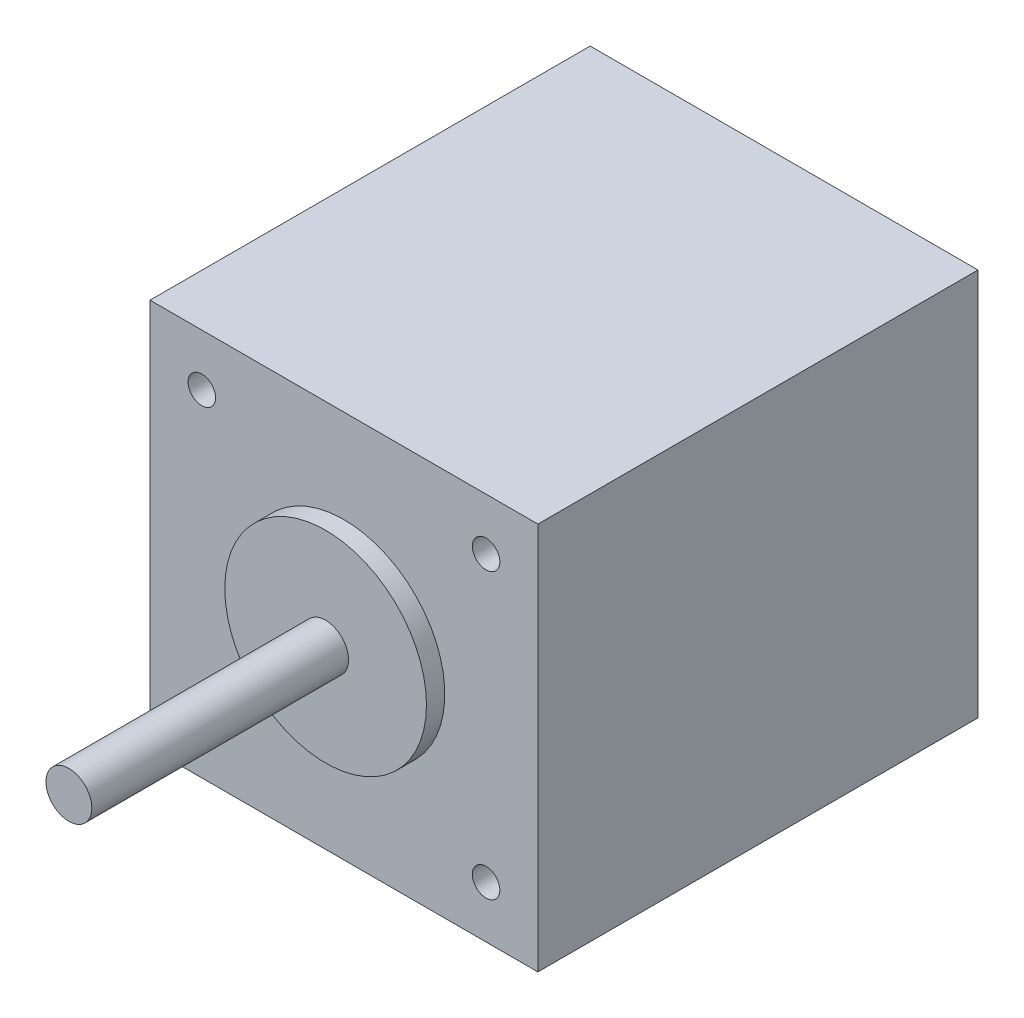
ISO-10303-21;
HEADER;
FILE_DESCRIPTION(('STEP AP214'),'2;1');
FILE_NAME('part.step','',(''),(''),'','','');
FILE_SCHEMA(('AUTOMOTIVE_DESIGN { 1 0 10303 214 1 1 1 1 }'));
ENDSEC;
DATA;
#1=APPLICATION_CONTEXT('core data for automotive mechanical design processes');
#2=APPLICATION_PROTOCOL_DEFINITION('international standard','automotive_design',2000,#1);
#3=PRODUCT_CONTEXT('',#1,'mechanical');
#4=PRODUCT('Part','Part','',(#3));
#5=PRODUCT_RELATED_PRODUCT_CATEGORY('part','',(#4));
#6=PRODUCT_DEFINITION_FORMATION('','',#4);
#7=PRODUCT_DEFINITION_CONTEXT('part definition',#1,'design');
#8=PRODUCT_DEFINITION('design','',#6,#7);
#9=PRODUCT_DEFINITION_SHAPE('','',#8);
#10=(LENGTH_UNIT() NAMED_UNIT(*) SI_UNIT(.MILLI.,.METRE.));
#11=(NAMED_UNIT(*) PLANE_ANGLE_UNIT() SI_UNIT($,.RADIAN.));
#12=(NAMED_UNIT(*) SI_UNIT($,.STERADIAN.) SOLID_ANGLE_UNIT());
#13=UNCERTAINTY_MEASURE_WITH_UNIT(LENGTH_MEASURE(1.E-05),#10,'distance_accuracy_value','');
#14=(GEOMETRIC_REPRESENTATION_CONTEXT(3) GLOBAL_UNCERTAINTY_ASSIGNED_CONTEXT((#13)) GLOBAL_UNIT_ASSIGNED_CONTEXT((#10,
#11,#12)) REPRESENTATION_CONTEXT('',''));
#15=CARTESIAN_POINT('',(0.,0.,0.));
#16=DIRECTION('',(0.,0.,1.));
#17=DIRECTION('',(1.,0.,0.));
#18=AXIS2_PLACEMENT_3D('',#15,#16,#17);
#19=CARTESIAN_POINT('',(21.15,-21.15,48.));
#20=DIRECTION('',(-1.,0.,0.));
#21=DIRECTION('',(0.,0.,1.));
#22=AXIS2_PLACEMENT_3D('',#19,#20,#21);
#23=PLANE('',#22);
#24=DIRECTION('',(0.,1.,0.));
#25=VECTOR('',#24,1.);
#26=CARTESIAN_POINT('',(21.15,-21.15,0.));
#27=LINE('',#26,#25);
#28=CARTESIAN_POINT('',(21.15,-21.15,0.));
#29=VERTEX_POINT('',#28);
#30=CARTESIAN_POINT('',(21.15,21.15,0.));
#31=VERTEX_POINT('',#30);
#32=EDGE_CURVE('E109',#29,#31,#27,.T.);
#33=ORIENTED_EDGE('',*,*,#32,.T.);
#34=DIRECTION('',(0.,0.,-1.));
#35=VECTOR('',#34,1.);
#36=CARTESIAN_POINT('',(21.15,21.15,48.));
#37=LINE('',#36,#35);
#38=CARTESIAN_POINT('',(21.15,21.15,48.));
#39=VERTEX_POINT('',#38);
#40=EDGE_CURVE('E50',#39,#31,#37,.T.);
#41=ORIENTED_EDGE('',*,*,#40,.F.);
#42=DIRECTION('',(0.,1.,0.));
#43=VECTOR('',#42,1.);
#44=CARTESIAN_POINT('',(21.15,-21.15,48.));
#45=LINE('',#44,#43);
#46=CARTESIAN_POINT('',(21.15,-21.15,48.));
#47=VERTEX_POINT('',#46);
#48=EDGE_CURVE('E95',#47,#39,#45,.T.);
#49=ORIENTED_EDGE('',*,*,#48,.F.);
#50=DIRECTION('',(0.,0.,-1.));
#51=VECTOR('',#50,1.);
#52=CARTESIAN_POINT('',(21.15,-21.15,48.));
#53=LINE('',#52,#51);
#54=EDGE_CURVE('E105',#47,#29,#53,.T.);
#55=ORIENTED_EDGE('',*,*,#54,.T.);
#56=EDGE_LOOP('',(#33,#41,#49,#55));
#57=FACE_BOUND('',#56,.T.);
#58=ADVANCED_FACE('F41',(#57),#23,.F.);
#59=CARTESIAN_POINT('',(-21.15,21.15,48.));
#60=DIRECTION('',(0.,-1.,0.));
#61=DIRECTION('',(0.,0.,-1.));
#62=AXIS2_PLACEMENT_3D('',#59,#60,#61);
#63=PLANE('',#62);
#64=DIRECTION('',(-1.,0.,0.));
#65=VECTOR('',#64,1.);
#66=CARTESIAN_POINT('',(-21.15,21.15,0.));
#67=LINE('',#66,#65);
#68=CARTESIAN_POINT('',(-21.15,21.15,0.));
#69=VERTEX_POINT('',#68);
#70=EDGE_CURVE('E100',#31,#69,#67,.T.);
#71=ORIENTED_EDGE('',*,*,#70,.T.);
#72=DIRECTION('',(0.,0.,-1.));
#73=VECTOR('',#72,1.);
#74=CARTESIAN_POINT('',(-21.15,21.15,48.));
#75=LINE('',#74,#73);
#76=CARTESIAN_POINT('',(-21.15,21.15,48.));
#77=VERTEX_POINT('',#76);
#78=EDGE_CURVE('E98',#77,#69,#75,.T.);
#79=ORIENTED_EDGE('',*,*,#78,.F.);
#80=DIRECTION('',(-1.,0.,0.));
#81=VECTOR('',#80,1.);
#82=CARTESIAN_POINT('',(-21.15,21.15,48.));
#83=LINE('',#82,#81);
#84=EDGE_CURVE('E90',#39,#77,#83,.T.);
#85=ORIENTED_EDGE('',*,*,#84,.F.);
#86=ORIENTED_EDGE('',*,*,#40,.T.);
#87=EDGE_LOOP('',(#71,#79,#85,#86));
#88=FACE_BOUND('',#87,.T.);
#89=ADVANCED_FACE('F99',(#88),#63,.F.);
#90=CARTESIAN_POINT('',(-21.15,-21.15,48.));
#91=DIRECTION('',(1.,0.,0.));
#92=DIRECTION('',(0.,0.,-1.));
#93=AXIS2_PLACEMENT_3D('',#90,#91,#92);
#94=PLANE('',#93);
#95=DIRECTION('',(0.,-1.,0.));
#96=VECTOR('',#95,1.);
#97=CARTESIAN_POINT('',(-21.15,-21.15,0.));
#98=LINE('',#97,#96);
#99=CARTESIAN_POINT('',(-21.15,-21.15,0.));
#100=VERTEX_POINT('',#99);
#101=EDGE_CURVE('E76',#69,#100,#98,.T.);
#102=ORIENTED_EDGE('',*,*,#101,.T.);
#103=DIRECTION('',(0.,0.,-1.));
#104=VECTOR('',#103,1.);
#105=CARTESIAN_POINT('',(-21.15,-21.15,48.));
#106=LINE('',#105,#104);
#107=CARTESIAN_POINT('',(-21.15,-21.15,48.));
#108=VERTEX_POINT('',#107);
#109=EDGE_CURVE('E101',#108,#100,#106,.T.);
#110=ORIENTED_EDGE('',*,*,#109,.F.);
#111=DIRECTION('',(0.,-1.,0.));
#112=VECTOR('',#111,1.);
#113=CARTESIAN_POINT('',(-21.15,-21.15,48.));
#114=LINE('',#113,#112);
#115=EDGE_CURVE('E93',#77,#108,#114,.T.);
#116=ORIENTED_EDGE('',*,*,#115,.F.);
#117=ORIENTED_EDGE('',*,*,#78,.T.);
#118=EDGE_LOOP('',(#102,#110,#116,#117));
#119=FACE_BOUND('',#118,.T.);
#120=ADVANCED_FACE('F103',(#119),#94,.F.);
#121=CARTESIAN_POINT('',(-21.15,-21.15,48.));
#122=DIRECTION('',(0.,1.,0.));
#123=DIRECTION('',(0.,0.,1.));
#124=AXIS2_PLACEMENT_3D('',#121,#122,#123);
#125=PLANE('',#124);
#126=DIRECTION('',(1.,0.,0.));
#127=VECTOR('',#126,1.);
#128=CARTESIAN_POINT('',(-21.15,-21.15,0.));
#129=LINE('',#128,#127);
#130=EDGE_CURVE('E82',#100,#29,#129,.T.);
#131=ORIENTED_EDGE('',*,*,#130,.T.);
#132=ORIENTED_EDGE('',*,*,#54,.F.);
#133=DIRECTION('',(1.,0.,0.));
#134=VECTOR('',#133,1.);
#135=CARTESIAN_POINT('',(-21.15,-21.15,48.));
#136=LINE('',#135,#134);
#137=EDGE_CURVE('E59',#108,#47,#136,.T.);
#138=ORIENTED_EDGE('',*,*,#137,.F.);
#139=ORIENTED_EDGE('',*,*,#109,.T.);
#140=EDGE_LOOP('',(#131,#132,#138,#139));
#141=FACE_BOUND('',#140,.T.);
#142=ADVANCED_FACE('F132',(#141),#125,.F.);
#143=CARTESIAN_POINT('',(0.,0.,48.));
#144=DIRECTION('',(0.,0.,-1.));
#145=DIRECTION('',(-1.,0.,0.));
#146=AXIS2_PLACEMENT_3D('',#143,#144,#145);
#147=PLANE('',#146);
#148=CARTESIAN_POINT('',(-15.5,15.5,48.));
#149=DIRECTION('',(0.,0.,1.));
#150=DIRECTION('',(1.,0.,0.));
#151=AXIS2_PLACEMENT_3D('',#148,#149,#150);
#152=CIRCLE('',#151,1.5);
#153=CARTESIAN_POINT('',(-14.,15.5,48.));
#154=VERTEX_POINT('',#153);
#155=EDGE_CURVE('E281',#154,#154,#152,.T.);
#156=ORIENTED_EDGE('',*,*,#155,.F.);
#157=EDGE_LOOP('',(#156));
#158=FACE_BOUND('',#157,.T.);
#159=CARTESIAN_POINT('',(15.5,-15.5,48.));
#160=DIRECTION('',(0.,0.,1.));
#161=DIRECTION('',(1.,0.,0.));
#162=AXIS2_PLACEMENT_3D('',#159,#160,#161);
#163=CIRCLE('',#162,1.5);
#164=CARTESIAN_POINT('',(17.,-15.5,48.));
#165=VERTEX_POINT('',#164);
#166=EDGE_CURVE('E287',#165,#165,#163,.T.);
#167=ORIENTED_EDGE('',*,*,#166,.F.);
#168=EDGE_LOOP('',(#167));
#169=FACE_BOUND('',#168,.T.);
#170=CARTESIAN_POINT('',(15.5,15.5,48.));
#171=DIRECTION('',(0.,0.,1.));
#172=DIRECTION('',(1.,0.,0.));
#173=AXIS2_PLACEMENT_3D('',#170,#171,#172);
#174=CIRCLE('',#173,1.5);
#175=CARTESIAN_POINT('',(17.,15.5,48.));
#176=VERTEX_POINT('',#175);
#177=EDGE_CURVE('E288',#176,#176,#174,.T.);
#178=ORIENTED_EDGE('',*,*,#177,.F.);
#179=EDGE_LOOP('',(#178));
#180=FACE_BOUND('',#179,.T.);
#181=CARTESIAN_POINT('',(-15.5,-15.5,48.));
#182=DIRECTION('',(0.,0.,1.));
#183=DIRECTION('',(1.,0.,0.));
#184=AXIS2_PLACEMENT_3D('',#181,#182,#183);
#185=CIRCLE('',#184,1.5);
#186=CARTESIAN_POINT('',(-14.,-15.5,48.));
#187=VERTEX_POINT('',#186);
#188=EDGE_CURVE('E278',#187,#187,#185,.T.);
#189=ORIENTED_EDGE('',*,*,#188,.F.);
#190=EDGE_LOOP('',(#189));
#191=FACE_BOUND('',#190,.T.);
#192=CARTESIAN_POINT('',(0.,0.,48.));
#193=DIRECTION('',(0.,0.,-1.));
#194=DIRECTION('',(-1.,0.,0.));
#195=AXIS2_PLACEMENT_3D('',#192,#193,#194);
#196=CIRCLE('',#195,11.);
#197=CARTESIAN_POINT('',(-11.,0.,48.));
#198=VERTEX_POINT('',#197);
#199=EDGE_CURVE('E11',#198,#198,#196,.F.);
#200=ORIENTED_EDGE('',*,*,#199,.F.);
#201=EDGE_LOOP('',(#200));
#202=FACE_BOUND('',#201,.T.);
#203=ORIENTED_EDGE('',*,*,#48,.T.);
#204=ORIENTED_EDGE('',*,*,#84,.T.);
#205=ORIENTED_EDGE('',*,*,#115,.T.);
#206=ORIENTED_EDGE('',*,*,#137,.T.);
#207=EDGE_LOOP('',(#203,#204,#205,#206));
#208=FACE_BOUND('',#207,.T.);
#209=ADVANCED_FACE('F91',(#158,#169,#180,#191,#202,#208),#147,.F.);
#210=CARTESIAN_POINT('',(0.,0.,0.));
#211=DIRECTION('',(0.,0.,-1.));
#212=DIRECTION('',(-1.,0.,0.));
#213=AXIS2_PLACEMENT_3D('',#210,#211,#212);
#214=PLANE('',#213);
#215=ORIENTED_EDGE('',*,*,#32,.F.);
#216=ORIENTED_EDGE('',*,*,#130,.F.);
#217=ORIENTED_EDGE('',*,*,#101,.F.);
#218=ORIENTED_EDGE('',*,*,#70,.F.);
#219=EDGE_LOOP('',(#215,#216,#217,#218));
#220=FACE_BOUND('',#219,.T.);
#221=ADVANCED_FACE('F120',(#220),#214,.T.);
#222=CARTESIAN_POINT('',(0.,0.,50.));
#223=DIRECTION('',(0.,0.,-1.));
#224=DIRECTION('',(-1.,0.,0.));
#225=AXIS2_PLACEMENT_3D('',#222,#223,#224);
#226=CYLINDRICAL_SURFACE('',#225,11.);
#227=CARTESIAN_POINT('',(0.,0.,50.));
#228=DIRECTION('',(0.,0.,1.));
#229=DIRECTION('',(1.,0.,0.));
#230=AXIS2_PLACEMENT_3D('',#227,#228,#229);
#231=CIRCLE('',#230,11.);
#232=CARTESIAN_POINT('',(11.,0.,50.));
#233=VERTEX_POINT('',#232);
#234=EDGE_CURVE('E273',#233,#233,#231,.T.);
#235=ORIENTED_EDGE('',*,*,#234,.F.);
#236=EDGE_LOOP('',(#235));
#237=FACE_BOUND('',#236,.T.);
#238=ORIENTED_EDGE('',*,*,#199,.T.);
#239=EDGE_LOOP('',(#238));
#240=FACE_BOUND('',#239,.T.);
#241=ADVANCED_FACE('F122',(#237,#240),#226,.T.);
#242=CARTESIAN_POINT('',(0.,0.,50.));
#243=DIRECTION('',(0.,0.,1.));
#244=DIRECTION('',(1.,0.,0.));
#245=AXIS2_PLACEMENT_3D('',#242,#243,#244);
#246=PLANE('',#245);
#247=CARTESIAN_POINT('',(0.,0.,50.));
#248=DIRECTION('',(0.,0.,1.));
#249=DIRECTION('',(1.,0.,0.));
#250=AXIS2_PLACEMENT_3D('',#247,#248,#249);
#251=CIRCLE('',#250,2.5);
#252=CARTESIAN_POINT('',(2.5,0.,50.));
#253=VERTEX_POINT('',#252);
#254=EDGE_CURVE('E44',#253,#253,#251,.T.);
#255=ORIENTED_EDGE('',*,*,#254,.F.);
#256=EDGE_LOOP('',(#255));
#257=FACE_BOUND('',#256,.T.);
#258=ORIENTED_EDGE('',*,*,#234,.T.);
#259=EDGE_LOOP('',(#258));
#260=FACE_BOUND('',#259,.T.);
#261=ADVANCED_FACE('F128',(#257,#260),#246,.T.);
#262=CARTESIAN_POINT('',(0.,0.,78.));
#263=DIRECTION('',(0.,0.,1.));
#264=DIRECTION('',(1.,0.,0.));
#265=AXIS2_PLACEMENT_3D('',#262,#263,#264);
#266=PLANE('',#265);
#267=CARTESIAN_POINT('',(0.,0.,78.));
#268=DIRECTION('',(0.,0.,1.));
#269=DIRECTION('',(1.,0.,0.));
#270=AXIS2_PLACEMENT_3D('',#267,#268,#269);
#271=CIRCLE('',#270,2.5);
#272=CARTESIAN_POINT('',(2.5,0.,78.));
#273=VERTEX_POINT('',#272);
#274=EDGE_CURVE('E112',#273,#273,#271,.T.);
#275=ORIENTED_EDGE('',*,*,#274,.T.);
#276=EDGE_LOOP('',(#275));
#277=FACE_BOUND('',#276,.T.);
#278=ADVANCED_FACE('F153',(#277),#266,.T.);
#279=CARTESIAN_POINT('',(0.,0.,78.));
#280=DIRECTION('',(0.,0.,-1.));
#281=DIRECTION('',(-1.,0.,0.));
#282=AXIS2_PLACEMENT_3D('',#279,#280,#281);
#283=CYLINDRICAL_SURFACE('',#282,2.5);
#284=ORIENTED_EDGE('',*,*,#254,.T.);
#285=EDGE_LOOP('',(#284));
#286=FACE_BOUND('',#285,.T.);
#287=ORIENTED_EDGE('',*,*,#274,.F.);
#288=EDGE_LOOP('',(#287));
#289=FACE_BOUND('',#288,.T.);
#290=ADVANCED_FACE('F156',(#286,#289),#283,.T.);
#291=CARTESIAN_POINT('',(-15.5,-15.5,43.5));
#292=DIRECTION('',(0.,0.,1.));
#293=DIRECTION('',(1.,0.,0.));
#294=AXIS2_PLACEMENT_3D('',#291,#292,#293);
#295=CYLINDRICAL_SURFACE('',#294,1.5);
#296=CARTESIAN_POINT('',(-15.5,-15.5,43.5));
#297=DIRECTION('',(0.,0.,1.));
#298=DIRECTION('',(1.,0.,0.));
#299=AXIS2_PLACEMENT_3D('',#296,#297,#298);
#300=CIRCLE('',#299,1.5);
#301=CARTESIAN_POINT('',(-14.,-15.5,43.5));
#302=VERTEX_POINT('',#301);
#303=EDGE_CURVE('E277',#302,#302,#300,.T.);
#304=ORIENTED_EDGE('',*,*,#303,.F.);
#305=EDGE_LOOP('',(#304));
#306=FACE_BOUND('',#305,.T.);
#307=ORIENTED_EDGE('',*,*,#188,.T.);
#308=EDGE_LOOP('',(#307));
#309=FACE_BOUND('',#308,.T.);
#310=ADVANCED_FACE('F185',(#306,#309),#295,.F.);
#311=CARTESIAN_POINT('',(-15.5,-15.5,43.5));
#312=DIRECTION('',(0.,0.,1.));
#313=DIRECTION('',(1.,0.,0.));
#314=AXIS2_PLACEMENT_3D('',#311,#312,#313);
#315=PLANE('',#314);
#316=ORIENTED_EDGE('',*,*,#303,.T.);
#317=EDGE_LOOP('',(#316));
#318=FACE_BOUND('',#317,.T.);
#319=ADVANCED_FACE('F190',(#318),#315,.T.);
#320=CARTESIAN_POINT('',(15.5,15.5,43.5));
#321=DIRECTION('',(0.,0.,1.));
#322=DIRECTION('',(1.,0.,0.));
#323=AXIS2_PLACEMENT_3D('',#320,#321,#322);
#324=CYLINDRICAL_SURFACE('',#323,1.5);
#325=CARTESIAN_POINT('',(15.5,15.5,43.5));
#326=DIRECTION('',(0.,0.,1.));
#327=DIRECTION('',(1.,0.,0.));
#328=AXIS2_PLACEMENT_3D('',#325,#326,#327);
#329=CIRCLE('',#328,1.5);
#330=CARTESIAN_POINT('',(17.,15.5,43.5));
#331=VERTEX_POINT('',#330);
#332=EDGE_CURVE('E295',#331,#331,#329,.T.);
#333=ORIENTED_EDGE('',*,*,#332,.F.);
#334=EDGE_LOOP('',(#333));
#335=FACE_BOUND('',#334,.T.);
#336=ORIENTED_EDGE('',*,*,#177,.T.);
#337=EDGE_LOOP('',(#336));
#338=FACE_BOUND('',#337,.T.);
#339=ADVANCED_FACE('F200',(#335,#338),#324,.F.);
#340=CARTESIAN_POINT('',(15.5,15.5,43.5));
#341=DIRECTION('',(0.,0.,1.));
#342=DIRECTION('',(1.,0.,0.));
#343=AXIS2_PLACEMENT_3D('',#340,#341,#342);
#344=PLANE('',#343);
#345=ORIENTED_EDGE('',*,*,#332,.T.);
#346=EDGE_LOOP('',(#345));
#347=FACE_BOUND('',#346,.T.);
#348=ADVANCED_FACE('F210',(#347),#344,.T.);
#349=CARTESIAN_POINT('',(15.5,-15.5,43.5));
#350=DIRECTION('',(0.,0.,1.));
#351=DIRECTION('',(1.,0.,0.));
#352=AXIS2_PLACEMENT_3D('',#349,#350,#351);
#353=CYLINDRICAL_SURFACE('',#352,1.5);
#354=CARTESIAN_POINT('',(15.5,-15.5,43.5));
#355=DIRECTION('',(0.,0.,1.));
#356=DIRECTION('',(1.,0.,0.));
#357=AXIS2_PLACEMENT_3D('',#354,#355,#356);
#358=CIRCLE('',#357,1.5);
#359=CARTESIAN_POINT('',(17.,-15.5,43.5));
#360=VERTEX_POINT('',#359);
#361=EDGE_CURVE('E284',#360,#360,#358,.T.);
#362=ORIENTED_EDGE('',*,*,#361,.F.);
#363=EDGE_LOOP('',(#362));
#364=FACE_BOUND('',#363,.T.);
#365=ORIENTED_EDGE('',*,*,#166,.T.);
#366=EDGE_LOOP('',(#365));
#367=FACE_BOUND('',#366,.T.);
#368=ADVANCED_FACE('F220',(#364,#367),#353,.F.);
#369=CARTESIAN_POINT('',(15.5,-15.5,43.5));
#370=DIRECTION('',(0.,0.,1.));
#371=DIRECTION('',(1.,0.,0.));
#372=AXIS2_PLACEMENT_3D('',#369,#370,#371);
#373=PLANE('',#372);
#374=ORIENTED_EDGE('',*,*,#361,.T.);
#375=EDGE_LOOP('',(#374));
#376=FACE_BOUND('',#375,.T.);
#377=ADVANCED_FACE('F230',(#376),#373,.T.);
#378=CARTESIAN_POINT('',(-15.5,15.5,43.5));
#379=DIRECTION('',(0.,0.,1.));
#380=DIRECTION('',(1.,0.,0.));
#381=AXIS2_PLACEMENT_3D('',#378,#379,#380);
#382=CYLINDRICAL_SURFACE('',#381,1.5);
#383=CARTESIAN_POINT('',(-15.5,15.5,43.5));
#384=DIRECTION('',(0.,0.,1.));
#385=DIRECTION('',(1.,0.,0.));
#386=AXIS2_PLACEMENT_3D('',#383,#384,#385);
#387=CIRCLE('',#386,1.5);
#388=CARTESIAN_POINT('',(-14.,15.5,43.5));
#389=VERTEX_POINT('',#388);
#390=EDGE_CURVE('E291',#389,#389,#387,.T.);
#391=ORIENTED_EDGE('',*,*,#390,.F.);
#392=EDGE_LOOP('',(#391));
#393=FACE_BOUND('',#392,.T.);
#394=ORIENTED_EDGE('',*,*,#155,.T.);
#395=EDGE_LOOP('',(#394));
#396=FACE_BOUND('',#395,.T.);
#397=ADVANCED_FACE('F240',(#393,#396),#382,.F.);
#398=CARTESIAN_POINT('',(-15.5,15.5,43.5));
#399=DIRECTION('',(0.,0.,1.));
#400=DIRECTION('',(1.,0.,0.));
#401=AXIS2_PLACEMENT_3D('',#398,#399,#400);
#402=PLANE('',#401);
#403=ORIENTED_EDGE('',*,*,#390,.T.);
#404=EDGE_LOOP('',(#403));
#405=FACE_BOUND('',#404,.T.);
#406=ADVANCED_FACE('F250',(#405),#402,.T.);
#407=CLOSED_SHELL('',(#58,#89,#120,#142,#209,#221,#241,#261,#278,#290,#310,#319,#339,#348,#368,
#377,#397,#406));
#408=MANIFOLD_SOLID_BREP('B2',#407);
#409=ADVANCED_BREP_SHAPE_REPRESENTATION('',(#18,#408),#14);
#410=SHAPE_DEFINITION_REPRESENTATION(#9,#409);
ENDSEC;
END-ISO-10303-21;
